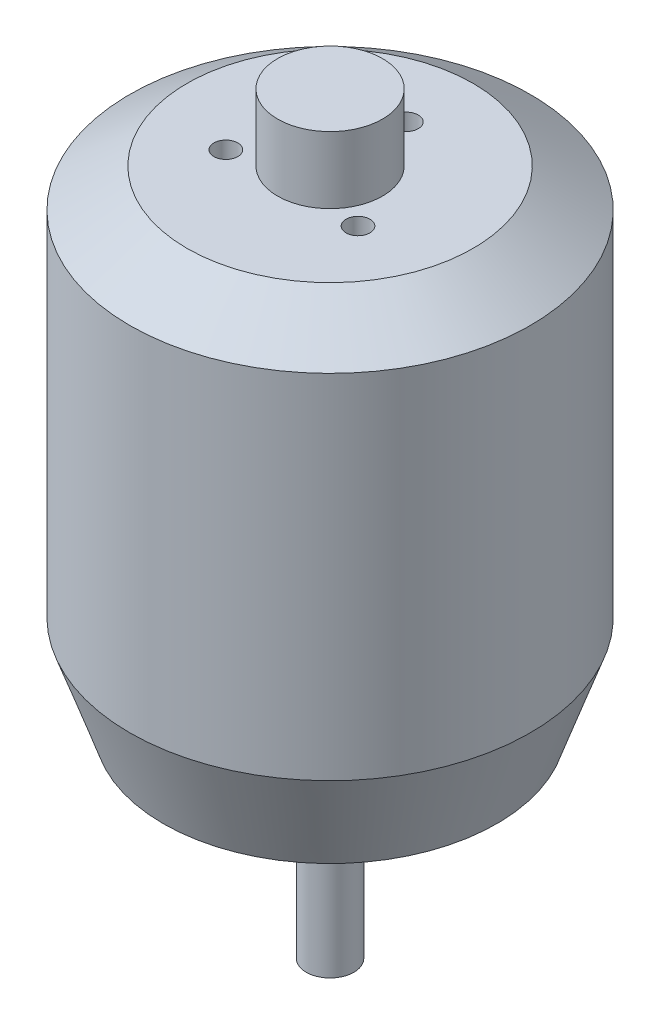
ISO-10303-21;
HEADER;
FILE_DESCRIPTION(('STEP AP214'),'2;1');
FILE_NAME('part.step','',(''),(''),'','','');
FILE_SCHEMA(('AUTOMOTIVE_DESIGN { 1 0 10303 214 1 1 1 1 }'));
ENDSEC;
DATA;
#1=APPLICATION_CONTEXT('core data for automotive mechanical design processes');
#2=APPLICATION_PROTOCOL_DEFINITION('international standard','automotive_design',2000,#1);
#3=PRODUCT_CONTEXT('',#1,'mechanical');
#4=PRODUCT('Part','Part','',(#3));
#5=PRODUCT_RELATED_PRODUCT_CATEGORY('part','',(#4));
#6=PRODUCT_DEFINITION_FORMATION('','',#4);
#7=PRODUCT_DEFINITION_CONTEXT('part definition',#1,'design');
#8=PRODUCT_DEFINITION('design','',#6,#7);
#9=PRODUCT_DEFINITION_SHAPE('','',#8);
#10=(LENGTH_UNIT() NAMED_UNIT(*) SI_UNIT(.MILLI.,.METRE.));
#11=(NAMED_UNIT(*) PLANE_ANGLE_UNIT() SI_UNIT($,.RADIAN.));
#12=(NAMED_UNIT(*) SI_UNIT($,.STERADIAN.) SOLID_ANGLE_UNIT());
#13=UNCERTAINTY_MEASURE_WITH_UNIT(LENGTH_MEASURE(1.E-05),#10,'distance_accuracy_value','');
#14=(GEOMETRIC_REPRESENTATION_CONTEXT(3) GLOBAL_UNCERTAINTY_ASSIGNED_CONTEXT((#13)) GLOBAL_UNIT_ASSIGNED_CONTEXT((#10,
#11,#12)) REPRESENTATION_CONTEXT('',''));
#15=CARTESIAN_POINT('',(0.,0.,0.));
#16=DIRECTION('',(0.,0.,1.));
#17=DIRECTION('',(1.,0.,0.));
#18=AXIS2_PLACEMENT_3D('',#15,#16,#17);
#19=CARTESIAN_POINT('',(0.,47.,0.));
#20=DIRECTION('',(0.,-1.,0.));
#21=DIRECTION('',(0.,0.,-1.));
#22=AXIS2_PLACEMENT_3D('',#19,#20,#21);
#23=CYLINDRICAL_SURFACE('',#22,21.);
#24=CARTESIAN_POINT('',(0.,47.,0.));
#25=DIRECTION('',(0.,1.,0.));
#26=DIRECTION('',(0.,0.,1.));
#27=AXIS2_PLACEMENT_3D('',#24,#25,#26);
#28=CIRCLE('',#27,21.);
#29=CARTESIAN_POINT('',(0.,47.,21.));
#30=VERTEX_POINT('',#29);
#31=EDGE_CURVE('E50',#30,#30,#28,.T.);
#32=ORIENTED_EDGE('',*,*,#31,.F.);
#33=EDGE_LOOP('',(#32));
#34=FACE_BOUND('',#33,.T.);
#35=CARTESIAN_POINT('',(0.,10.,0.));
#36=DIRECTION('',(0.,1.,0.));
#37=DIRECTION('',(0.,0.,1.));
#38=AXIS2_PLACEMENT_3D('',#35,#36,#37);
#39=CIRCLE('',#38,21.);
#40=CARTESIAN_POINT('',(0.,10.,21.));
#41=VERTEX_POINT('',#40);
#42=EDGE_CURVE('E64',#41,#41,#39,.T.);
#43=ORIENTED_EDGE('',*,*,#42,.T.);
#44=EDGE_LOOP('',(#43));
#45=FACE_BOUND('',#44,.T.);
#46=ADVANCED_FACE('F38',(#34,#45),#23,.T.);
#47=CARTESIAN_POINT('',(0.,0.,0.));
#48=DIRECTION('',(0.,1.,0.));
#49=DIRECTION('',(0.,0.,1.));
#50=AXIS2_PLACEMENT_3D('',#47,#48,#49);
#51=CONICAL_SURFACE('',#50,17.5,0.336674819386727);
#52=CARTESIAN_POINT('',(0.,0.,0.));
#53=DIRECTION('',(0.,1.,0.));
#54=DIRECTION('',(0.,0.,1.));
#55=AXIS2_PLACEMENT_3D('',#52,#53,#54);
#56=CIRCLE('',#55,17.5);
#57=CARTESIAN_POINT('',(0.,0.,17.5));
#58=VERTEX_POINT('',#57);
#59=EDGE_CURVE('E46',#58,#58,#56,.T.);
#60=ORIENTED_EDGE('',*,*,#59,.T.);
#61=EDGE_LOOP('',(#60));
#62=FACE_BOUND('',#61,.T.);
#63=ORIENTED_EDGE('',*,*,#42,.F.);
#64=EDGE_LOOP('',(#63));
#65=FACE_BOUND('',#64,.T.);
#66=ADVANCED_FACE('F172',(#62,#65),#51,.T.);
#67=CARTESIAN_POINT('',(0.,0.,0.));
#68=DIRECTION('',(0.,1.,0.));
#69=DIRECTION('',(0.,0.,1.));
#70=AXIS2_PLACEMENT_3D('',#67,#68,#69);
#71=PLANE('',#70);
#72=CARTESIAN_POINT('',(0.,0.,0.));
#73=DIRECTION('',(0.,1.,0.));
#74=DIRECTION('',(0.,0.,1.));
#75=AXIS2_PLACEMENT_3D('',#72,#73,#74);
#76=CIRCLE('',#75,5.25);
#77=CARTESIAN_POINT('',(0.,0.,5.25));
#78=VERTEX_POINT('',#77);
#79=EDGE_CURVE('E11',#78,#78,#76,.F.);
#80=ORIENTED_EDGE('',*,*,#79,.F.);
#81=EDGE_LOOP('',(#80));
#82=FACE_BOUND('',#81,.T.);
#83=CARTESIAN_POINT('',(-8.83883476483135,0.,-8.83883476483185));
#84=DIRECTION('',(0.,-1.,0.));
#85=DIRECTION('',(0.,0.,-1.));
#86=AXIS2_PLACEMENT_3D('',#83,#84,#85);
#87=CIRCLE('',#86,4.00000000000026);
#88=CARTESIAN_POINT('',(-8.83883476483135,0.,-12.8388347648321));
#89=VERTEX_POINT('',#88);
#90=EDGE_CURVE('E95',#89,#89,#87,.T.);
#91=ORIENTED_EDGE('',*,*,#90,.F.);
#92=EDGE_LOOP('',(#91));
#93=FACE_BOUND('',#92,.T.);
#94=CARTESIAN_POINT('',(8.83883476483235,0.,-8.83883476483135));
#95=DIRECTION('',(0.,-1.,0.));
#96=DIRECTION('',(0.,0.,-1.));
#97=AXIS2_PLACEMENT_3D('',#94,#95,#96);
#98=CIRCLE('',#97,4.0000000000007);
#99=CARTESIAN_POINT('',(8.83883476483235,0.,-12.838834764832));
#100=VERTEX_POINT('',#99);
#101=EDGE_CURVE('E101',#100,#100,#98,.T.);
#102=ORIENTED_EDGE('',*,*,#101,.F.);
#103=EDGE_LOOP('',(#102));
#104=FACE_BOUND('',#103,.T.);
#105=CARTESIAN_POINT('',(8.83883476483185,0.,8.83883476483234));
#106=DIRECTION('',(0.,-1.,0.));
#107=DIRECTION('',(0.,0.,-1.));
#108=AXIS2_PLACEMENT_3D('',#105,#106,#107);
#109=CIRCLE('',#108,4.00000000000051);
#110=CARTESIAN_POINT('',(8.83883476483185,0.,4.83883476483183));
#111=VERTEX_POINT('',#110);
#112=EDGE_CURVE('E107',#111,#111,#109,.T.);
#113=ORIENTED_EDGE('',*,*,#112,.F.);
#114=EDGE_LOOP('',(#113));
#115=FACE_BOUND('',#114,.T.);
#116=CARTESIAN_POINT('',(-8.83883476483184,0.,8.83883476483184));
#117=DIRECTION('',(0.,-1.,0.));
#118=DIRECTION('',(0.,0.,-1.));
#119=AXIS2_PLACEMENT_3D('',#116,#117,#118);
#120=CIRCLE('',#119,4.);
#121=CARTESIAN_POINT('',(-8.83883476483184,0.,4.83883476483184));
#122=VERTEX_POINT('',#121);
#123=EDGE_CURVE('E113',#122,#122,#120,.T.);
#124=ORIENTED_EDGE('',*,*,#123,.F.);
#125=EDGE_LOOP('',(#124));
#126=FACE_BOUND('',#125,.T.);
#127=CARTESIAN_POINT('',(-12.4999999999996,0.,-3.5527136788005E-13));
#128=DIRECTION('',(0.,-1.,0.));
#129=DIRECTION('',(0.,0.,-1.));
#130=AXIS2_PLACEMENT_3D('',#127,#128,#129);
#131=CIRCLE('',#130,1.50000000000057);
#132=CARTESIAN_POINT('',(-12.4999999999996,0.,-1.50000000000092));
#133=VERTEX_POINT('',#132);
#134=EDGE_CURVE('E77',#133,#133,#131,.T.);
#135=ORIENTED_EDGE('',*,*,#134,.F.);
#136=EDGE_LOOP('',(#135));
#137=FACE_BOUND('',#136,.T.);
#138=CARTESIAN_POINT('',(7.07481118762232E-13,0.,-12.5));
#139=DIRECTION('',(0.,-1.,0.));
#140=DIRECTION('',(0.,0.,-1.));
#141=AXIS2_PLACEMENT_3D('',#138,#139,#140);
#142=CIRCLE('',#141,1.50000000000076);
#143=CARTESIAN_POINT('',(7.07481118762232E-13,0.,-14.0000000000008));
#144=VERTEX_POINT('',#143);
#145=EDGE_CURVE('E84',#144,#144,#142,.T.);
#146=ORIENTED_EDGE('',*,*,#145,.F.);
#147=EDGE_LOOP('',(#146));
#148=FACE_BOUND('',#147,.T.);
#149=CARTESIAN_POINT('',(12.5000000000004,0.,3.53740559381116E-13));
#150=DIRECTION('',(0.,-1.,0.));
#151=DIRECTION('',(0.,0.,-1.));
#152=AXIS2_PLACEMENT_3D('',#149,#150,#151);
#153=CIRCLE('',#152,1.50000000000028);
#154=CARTESIAN_POINT('',(12.5000000000004,0.,-1.49999999999992));
#155=VERTEX_POINT('',#154);
#156=EDGE_CURVE('E90',#155,#155,#153,.T.);
#157=ORIENTED_EDGE('',*,*,#156,.F.);
#158=EDGE_LOOP('',(#157));
#159=FACE_BOUND('',#158,.T.);
#160=CARTESIAN_POINT('',(0.,0.,12.5));
#161=DIRECTION('',(0.,-1.,0.));
#162=DIRECTION('',(0.,0.,-1.));
#163=AXIS2_PLACEMENT_3D('',#160,#161,#162);
#164=CIRCLE('',#163,1.5);
#165=CARTESIAN_POINT('',(0.,0.,11.));
#166=VERTEX_POINT('',#165);
#167=EDGE_CURVE('E71',#166,#166,#164,.T.);
#168=ORIENTED_EDGE('',*,*,#167,.F.);
#169=EDGE_LOOP('',(#168));
#170=FACE_BOUND('',#169,.T.);
#171=ORIENTED_EDGE('',*,*,#59,.F.);
#172=EDGE_LOOP('',(#171));
#173=FACE_BOUND('',#172,.T.);
#174=ADVANCED_FACE('F40',(#82,#93,#104,#115,#126,#137,#148,#159,#170,#173),#71,.F.);
#175=CARTESIAN_POINT('',(0.,51.,0.));
#176=DIRECTION('',(0.,-1.,0.));
#177=DIRECTION('',(0.,0.,-1.));
#178=AXIS2_PLACEMENT_3D('',#175,#176,#177);
#179=CONICAL_SURFACE('',#178,15.,0.982793723247329);
#180=CARTESIAN_POINT('',(0.,51.,0.));
#181=DIRECTION('',(0.,1.,0.));
#182=DIRECTION('',(0.,0.,1.));
#183=AXIS2_PLACEMENT_3D('',#180,#181,#182);
#184=CIRCLE('',#183,15.);
#185=CARTESIAN_POINT('',(0.,51.,15.));
#186=VERTEX_POINT('',#185);
#187=EDGE_CURVE('E67',#186,#186,#184,.T.);
#188=ORIENTED_EDGE('',*,*,#187,.F.);
#189=EDGE_LOOP('',(#188));
#190=FACE_BOUND('',#189,.T.);
#191=ORIENTED_EDGE('',*,*,#31,.T.);
#192=EDGE_LOOP('',(#191));
#193=FACE_BOUND('',#192,.T.);
#194=ADVANCED_FACE('F163',(#190,#193),#179,.T.);
#195=CARTESIAN_POINT('',(0.,58.,0.));
#196=DIRECTION('',(0.,1.,0.));
#197=DIRECTION('',(0.,0.,1.));
#198=AXIS2_PLACEMENT_3D('',#195,#196,#197);
#199=PLANE('',#198);
#200=CARTESIAN_POINT('',(0.,58.,0.));
#201=DIRECTION('',(0.,1.,0.));
#202=DIRECTION('',(0.,0.,1.));
#203=AXIS2_PLACEMENT_3D('',#200,#201,#202);
#204=CIRCLE('',#203,5.5);
#205=CARTESIAN_POINT('',(0.,58.,5.5));
#206=VERTEX_POINT('',#205);
#207=EDGE_CURVE('E55',#206,#206,#204,.T.);
#208=ORIENTED_EDGE('',*,*,#207,.T.);
#209=EDGE_LOOP('',(#208));
#210=FACE_BOUND('',#209,.T.);
#211=ADVANCED_FACE('F166',(#210),#199,.T.);
#212=CARTESIAN_POINT('',(0.,58.,0.));
#213=DIRECTION('',(0.,-1.,0.));
#214=DIRECTION('',(0.,0.,-1.));
#215=AXIS2_PLACEMENT_3D('',#212,#213,#214);
#216=CYLINDRICAL_SURFACE('',#215,5.5);
#217=ORIENTED_EDGE('',*,*,#207,.F.);
#218=EDGE_LOOP('',(#217));
#219=FACE_BOUND('',#218,.T.);
#220=CARTESIAN_POINT('',(0.,51.,0.));
#221=DIRECTION('',(0.,1.,0.));
#222=DIRECTION('',(0.,0.,1.));
#223=AXIS2_PLACEMENT_3D('',#220,#221,#222);
#224=CIRCLE('',#223,5.5);
#225=CARTESIAN_POINT('',(0.,51.,5.5));
#226=VERTEX_POINT('',#225);
#227=EDGE_CURVE('E56',#226,#226,#224,.T.);
#228=ORIENTED_EDGE('',*,*,#227,.T.);
#229=EDGE_LOOP('',(#228));
#230=FACE_BOUND('',#229,.T.);
#231=ADVANCED_FACE('F153',(#219,#230),#216,.T.);
#232=CARTESIAN_POINT('',(0.,51.,0.));
#233=DIRECTION('',(0.,1.,0.));
#234=DIRECTION('',(0.,0.,1.));
#235=AXIS2_PLACEMENT_3D('',#232,#233,#234);
#236=PLANE('',#235);
#237=CARTESIAN_POINT('',(6.92820323027602,51.,3.9999999999997));
#238=DIRECTION('',(0.,1.,0.));
#239=DIRECTION('',(0.,0.,1.));
#240=AXIS2_PLACEMENT_3D('',#237,#238,#239);
#241=CIRCLE('',#240,1.25000000000044);
#242=CARTESIAN_POINT('',(6.92820323027602,51.,5.25000000000014));
#243=VERTEX_POINT('',#242);
#244=EDGE_CURVE('E134',#243,#243,#241,.T.);
#245=ORIENTED_EDGE('',*,*,#244,.F.);
#246=EDGE_LOOP('',(#245));
#247=FACE_BOUND('',#246,.T.);
#248=CARTESIAN_POINT('',(-6.928203230275,51.,4.0000000000003));
#249=DIRECTION('',(0.,1.,0.));
#250=DIRECTION('',(0.,0.,1.));
#251=AXIS2_PLACEMENT_3D('',#248,#249,#250);
#252=CIRCLE('',#251,1.25000000000065);
#253=CARTESIAN_POINT('',(-6.928203230275,51.,5.25000000000095));
#254=VERTEX_POINT('',#253);
#255=EDGE_CURVE('E128',#254,#254,#252,.T.);
#256=ORIENTED_EDGE('',*,*,#255,.F.);
#257=EDGE_LOOP('',(#256));
#258=FACE_BOUND('',#257,.T.);
#259=CARTESIAN_POINT('',(0.,51.,-8.));
#260=DIRECTION('',(0.,1.,0.));
#261=DIRECTION('',(0.,0.,1.));
#262=AXIS2_PLACEMENT_3D('',#259,#260,#261);
#263=CIRCLE('',#262,1.25);
#264=CARTESIAN_POINT('',(0.,51.,-6.75));
#265=VERTEX_POINT('',#264);
#266=EDGE_CURVE('E122',#265,#265,#263,.T.);
#267=ORIENTED_EDGE('',*,*,#266,.F.);
#268=EDGE_LOOP('',(#267));
#269=FACE_BOUND('',#268,.T.);
#270=ORIENTED_EDGE('',*,*,#227,.F.);
#271=EDGE_LOOP('',(#270));
#272=FACE_BOUND('',#271,.T.);
#273=ORIENTED_EDGE('',*,*,#187,.T.);
#274=EDGE_LOOP('',(#273));
#275=FACE_BOUND('',#274,.T.);
#276=ADVANCED_FACE('F149',(#247,#258,#269,#272,#275),#236,.T.);
#277=CARTESIAN_POINT('',(0.,10.,12.5));
#278=DIRECTION('',(0.,-1.,0.));
#279=DIRECTION('',(0.,0.,-1.));
#280=AXIS2_PLACEMENT_3D('',#277,#278,#279);
#281=CYLINDRICAL_SURFACE('',#280,1.5);
#282=CARTESIAN_POINT('',(0.,10.,12.5));
#283=DIRECTION('',(0.,-1.,0.));
#284=DIRECTION('',(0.,0.,-1.));
#285=AXIS2_PLACEMENT_3D('',#282,#283,#284);
#286=CIRCLE('',#285,1.5);
#287=CARTESIAN_POINT('',(0.,10.,11.));
#288=VERTEX_POINT('',#287);
#289=EDGE_CURVE('E70',#288,#288,#286,.T.);
#290=ORIENTED_EDGE('',*,*,#289,.F.);
#291=EDGE_LOOP('',(#290));
#292=FACE_BOUND('',#291,.T.);
#293=ORIENTED_EDGE('',*,*,#167,.T.);
#294=EDGE_LOOP('',(#293));
#295=FACE_BOUND('',#294,.T.);
#296=ADVANCED_FACE('F152',(#292,#295),#281,.F.);
#297=CARTESIAN_POINT('',(0.,10.,12.5));
#298=DIRECTION('',(0.,-1.,0.));
#299=DIRECTION('',(0.,0.,-1.));
#300=AXIS2_PLACEMENT_3D('',#297,#298,#299);
#301=PLANE('',#300);
#302=ORIENTED_EDGE('',*,*,#289,.T.);
#303=EDGE_LOOP('',(#302));
#304=FACE_BOUND('',#303,.T.);
#305=ADVANCED_FACE('F218',(#304),#301,.T.);
#306=CARTESIAN_POINT('',(12.5000000000004,10.,3.53740559381116E-13));
#307=DIRECTION('',(0.,-1.,0.));
#308=DIRECTION('',(0.,0.,-1.));
#309=AXIS2_PLACEMENT_3D('',#306,#307,#308);
#310=CYLINDRICAL_SURFACE('',#309,1.50000000000028);
#311=CARTESIAN_POINT('',(12.5000000000004,10.,3.53740559381116E-13));
#312=DIRECTION('',(0.,-1.,0.));
#313=DIRECTION('',(0.,0.,-1.));
#314=AXIS2_PLACEMENT_3D('',#311,#312,#313);
#315=CIRCLE('',#314,1.50000000000028);
#316=CARTESIAN_POINT('',(12.5000000000004,10.,-1.49999999999992));
#317=VERTEX_POINT('',#316);
#318=EDGE_CURVE('E74',#317,#317,#315,.T.);
#319=ORIENTED_EDGE('',*,*,#318,.F.);
#320=EDGE_LOOP('',(#319));
#321=FACE_BOUND('',#320,.T.);
#322=ORIENTED_EDGE('',*,*,#156,.T.);
#323=EDGE_LOOP('',(#322));
#324=FACE_BOUND('',#323,.T.);
#325=ADVANCED_FACE('F226',(#321,#324),#310,.F.);
#326=CARTESIAN_POINT('',(12.5000000000004,10.,3.53740559381116E-13));
#327=DIRECTION('',(0.,-1.,0.));
#328=DIRECTION('',(0.,0.,-1.));
#329=AXIS2_PLACEMENT_3D('',#326,#327,#328);
#330=PLANE('',#329);
#331=ORIENTED_EDGE('',*,*,#318,.T.);
#332=EDGE_LOOP('',(#331));
#333=FACE_BOUND('',#332,.T.);
#334=ADVANCED_FACE('F234',(#333),#330,.T.);
#335=CARTESIAN_POINT('',(7.07481118762232E-13,10.,-12.5));
#336=DIRECTION('',(0.,-1.,0.));
#337=DIRECTION('',(0.,0.,-1.));
#338=AXIS2_PLACEMENT_3D('',#335,#336,#337);
#339=CYLINDRICAL_SURFACE('',#338,1.50000000000076);
#340=CARTESIAN_POINT('',(7.07481118762232E-13,10.,-12.5));
#341=DIRECTION('',(0.,-1.,0.));
#342=DIRECTION('',(0.,0.,-1.));
#343=AXIS2_PLACEMENT_3D('',#340,#341,#342);
#344=CIRCLE('',#343,1.50000000000076);
#345=CARTESIAN_POINT('',(7.07481118762232E-13,10.,-14.0000000000008));
#346=VERTEX_POINT('',#345);
#347=EDGE_CURVE('E87',#346,#346,#344,.T.);
#348=ORIENTED_EDGE('',*,*,#347,.F.);
#349=EDGE_LOOP('',(#348));
#350=FACE_BOUND('',#349,.T.);
#351=ORIENTED_EDGE('',*,*,#145,.T.);
#352=EDGE_LOOP('',(#351));
#353=FACE_BOUND('',#352,.T.);
#354=ADVANCED_FACE('F242',(#350,#353),#339,.F.);
#355=CARTESIAN_POINT('',(7.07481118762232E-13,10.,-12.5));
#356=DIRECTION('',(0.,-1.,0.));
#357=DIRECTION('',(0.,0.,-1.));
#358=AXIS2_PLACEMENT_3D('',#355,#356,#357);
#359=PLANE('',#358);
#360=ORIENTED_EDGE('',*,*,#347,.T.);
#361=EDGE_LOOP('',(#360));
#362=FACE_BOUND('',#361,.T.);
#363=ADVANCED_FACE('F250',(#362),#359,.T.);
#364=CARTESIAN_POINT('',(-12.4999999999996,10.,-3.5527136788005E-13));
#365=DIRECTION('',(0.,-1.,0.));
#366=DIRECTION('',(0.,0.,-1.));
#367=AXIS2_PLACEMENT_3D('',#364,#365,#366);
#368=CYLINDRICAL_SURFACE('',#367,1.50000000000057);
#369=CARTESIAN_POINT('',(-12.4999999999996,10.,-3.5527136788005E-13));
#370=DIRECTION('',(0.,-1.,0.));
#371=DIRECTION('',(0.,0.,-1.));
#372=AXIS2_PLACEMENT_3D('',#369,#370,#371);
#373=CIRCLE('',#372,1.50000000000057);
#374=CARTESIAN_POINT('',(-12.4999999999996,10.,-1.50000000000092));
#375=VERTEX_POINT('',#374);
#376=EDGE_CURVE('E80',#375,#375,#373,.T.);
#377=ORIENTED_EDGE('',*,*,#376,.F.);
#378=EDGE_LOOP('',(#377));
#379=FACE_BOUND('',#378,.T.);
#380=ORIENTED_EDGE('',*,*,#134,.T.);
#381=EDGE_LOOP('',(#380));
#382=FACE_BOUND('',#381,.T.);
#383=ADVANCED_FACE('F258',(#379,#382),#368,.F.);
#384=CARTESIAN_POINT('',(-12.4999999999996,10.,-3.5527136788005E-13));
#385=DIRECTION('',(0.,-1.,0.));
#386=DIRECTION('',(0.,0.,-1.));
#387=AXIS2_PLACEMENT_3D('',#384,#385,#386);
#388=PLANE('',#387);
#389=ORIENTED_EDGE('',*,*,#376,.T.);
#390=EDGE_LOOP('',(#389));
#391=FACE_BOUND('',#390,.T.);
#392=ADVANCED_FACE('F266',(#391),#388,.T.);
#393=CARTESIAN_POINT('',(-8.83883476483184,10.,8.83883476483184));
#394=DIRECTION('',(0.,-1.,0.));
#395=DIRECTION('',(0.,0.,-1.));
#396=AXIS2_PLACEMENT_3D('',#393,#394,#395);
#397=CYLINDRICAL_SURFACE('',#396,4.);
#398=CARTESIAN_POINT('',(-8.83883476483184,10.,8.83883476483184));
#399=DIRECTION('',(0.,-1.,0.));
#400=DIRECTION('',(0.,0.,-1.));
#401=AXIS2_PLACEMENT_3D('',#398,#399,#400);
#402=CIRCLE('',#401,4.);
#403=CARTESIAN_POINT('',(-8.83883476483184,10.,4.83883476483184));
#404=VERTEX_POINT('',#403);
#405=EDGE_CURVE('E81',#404,#404,#402,.T.);
#406=ORIENTED_EDGE('',*,*,#405,.F.);
#407=EDGE_LOOP('',(#406));
#408=FACE_BOUND('',#407,.T.);
#409=ORIENTED_EDGE('',*,*,#123,.T.);
#410=EDGE_LOOP('',(#409));
#411=FACE_BOUND('',#410,.T.);
#412=ADVANCED_FACE('F274',(#408,#411),#397,.F.);
#413=CARTESIAN_POINT('',(-8.83883476483184,10.,8.83883476483184));
#414=DIRECTION('',(0.,-1.,0.));
#415=DIRECTION('',(0.,0.,-1.));
#416=AXIS2_PLACEMENT_3D('',#413,#414,#415);
#417=PLANE('',#416);
#418=ORIENTED_EDGE('',*,*,#405,.T.);
#419=EDGE_LOOP('',(#418));
#420=FACE_BOUND('',#419,.T.);
#421=ADVANCED_FACE('F282',(#420),#417,.T.);
#422=CARTESIAN_POINT('',(8.83883476483185,10.,8.83883476483234));
#423=DIRECTION('',(0.,-1.,0.));
#424=DIRECTION('',(0.,0.,-1.));
#425=AXIS2_PLACEMENT_3D('',#422,#423,#424);
#426=CYLINDRICAL_SURFACE('',#425,4.00000000000051);
#427=CARTESIAN_POINT('',(8.83883476483185,10.,8.83883476483234));
#428=DIRECTION('',(0.,-1.,0.));
#429=DIRECTION('',(0.,0.,-1.));
#430=AXIS2_PLACEMENT_3D('',#427,#428,#429);
#431=CIRCLE('',#430,4.00000000000051);
#432=CARTESIAN_POINT('',(8.83883476483185,10.,4.83883476483183));
#433=VERTEX_POINT('',#432);
#434=EDGE_CURVE('E110',#433,#433,#431,.T.);
#435=ORIENTED_EDGE('',*,*,#434,.F.);
#436=EDGE_LOOP('',(#435));
#437=FACE_BOUND('',#436,.T.);
#438=ORIENTED_EDGE('',*,*,#112,.T.);
#439=EDGE_LOOP('',(#438));
#440=FACE_BOUND('',#439,.T.);
#441=ADVANCED_FACE('F290',(#437,#440),#426,.F.);
#442=CARTESIAN_POINT('',(8.83883476483185,10.,8.83883476483234));
#443=DIRECTION('',(0.,-1.,0.));
#444=DIRECTION('',(0.,0.,-1.));
#445=AXIS2_PLACEMENT_3D('',#442,#443,#444);
#446=PLANE('',#445);
#447=ORIENTED_EDGE('',*,*,#434,.T.);
#448=EDGE_LOOP('',(#447));
#449=FACE_BOUND('',#448,.T.);
#450=ADVANCED_FACE('F298',(#449),#446,.T.);
#451=CARTESIAN_POINT('',(8.83883476483235,10.,-8.83883476483135));
#452=DIRECTION('',(0.,-1.,0.));
#453=DIRECTION('',(0.,0.,-1.));
#454=AXIS2_PLACEMENT_3D('',#451,#452,#453);
#455=CYLINDRICAL_SURFACE('',#454,4.0000000000007);
#456=CARTESIAN_POINT('',(8.83883476483235,10.,-8.83883476483135));
#457=DIRECTION('',(0.,-1.,0.));
#458=DIRECTION('',(0.,0.,-1.));
#459=AXIS2_PLACEMENT_3D('',#456,#457,#458);
#460=CIRCLE('',#459,4.0000000000007);
#461=CARTESIAN_POINT('',(8.83883476483235,10.,-12.838834764832));
#462=VERTEX_POINT('',#461);
#463=EDGE_CURVE('E104',#462,#462,#460,.T.);
#464=ORIENTED_EDGE('',*,*,#463,.F.);
#465=EDGE_LOOP('',(#464));
#466=FACE_BOUND('',#465,.T.);
#467=ORIENTED_EDGE('',*,*,#101,.T.);
#468=EDGE_LOOP('',(#467));
#469=FACE_BOUND('',#468,.T.);
#470=ADVANCED_FACE('F306',(#466,#469),#455,.F.);
#471=CARTESIAN_POINT('',(8.83883476483235,10.,-8.83883476483135));
#472=DIRECTION('',(0.,-1.,0.));
#473=DIRECTION('',(0.,0.,-1.));
#474=AXIS2_PLACEMENT_3D('',#471,#472,#473);
#475=PLANE('',#474);
#476=ORIENTED_EDGE('',*,*,#463,.T.);
#477=EDGE_LOOP('',(#476));
#478=FACE_BOUND('',#477,.T.);
#479=ADVANCED_FACE('F314',(#478),#475,.T.);
#480=CARTESIAN_POINT('',(-8.83883476483135,10.,-8.83883476483185));
#481=DIRECTION('',(0.,-1.,0.));
#482=DIRECTION('',(0.,0.,-1.));
#483=AXIS2_PLACEMENT_3D('',#480,#481,#482);
#484=CYLINDRICAL_SURFACE('',#483,4.00000000000026);
#485=CARTESIAN_POINT('',(-8.83883476483135,10.,-8.83883476483185));
#486=DIRECTION('',(0.,-1.,0.));
#487=DIRECTION('',(0.,0.,-1.));
#488=AXIS2_PLACEMENT_3D('',#485,#486,#487);
#489=CIRCLE('',#488,4.00000000000026);
#490=CARTESIAN_POINT('',(-8.83883476483135,10.,-12.8388347648321));
#491=VERTEX_POINT('',#490);
#492=EDGE_CURVE('E98',#491,#491,#489,.T.);
#493=ORIENTED_EDGE('',*,*,#492,.F.);
#494=EDGE_LOOP('',(#493));
#495=FACE_BOUND('',#494,.T.);
#496=ORIENTED_EDGE('',*,*,#90,.T.);
#497=EDGE_LOOP('',(#496));
#498=FACE_BOUND('',#497,.T.);
#499=ADVANCED_FACE('F322',(#495,#498),#484,.F.);
#500=CARTESIAN_POINT('',(-8.83883476483135,10.,-8.83883476483185));
#501=DIRECTION('',(0.,-1.,0.));
#502=DIRECTION('',(0.,0.,-1.));
#503=AXIS2_PLACEMENT_3D('',#500,#501,#502);
#504=PLANE('',#503);
#505=ORIENTED_EDGE('',*,*,#492,.T.);
#506=EDGE_LOOP('',(#505));
#507=FACE_BOUND('',#506,.T.);
#508=ADVANCED_FACE('F330',(#507),#504,.T.);
#509=CARTESIAN_POINT('',(0.,-6.5,0.));
#510=DIRECTION('',(0.,1.,0.));
#511=DIRECTION('',(0.,0.,1.));
#512=AXIS2_PLACEMENT_3D('',#509,#510,#511);
#513=CYLINDRICAL_SURFACE('',#512,5.25);
#514=CARTESIAN_POINT('',(0.,-6.5,0.));
#515=DIRECTION('',(0.,-1.,0.));
#516=DIRECTION('',(0.,0.,-1.));
#517=AXIS2_PLACEMENT_3D('',#514,#515,#516);
#518=CIRCLE('',#517,5.25);
#519=CARTESIAN_POINT('',(0.,-6.5,5.25));
#520=VERTEX_POINT('',#519);
#521=EDGE_CURVE('E118',#520,#520,#518,.T.);
#522=CARTESIAN_POINT('',(0.,-6.5,5.25));
#523=CARTESIAN_POINT('',(0.,-6.43229166666667,5.25));
#524=CARTESIAN_POINT('',(0.,-6.36458333333333,5.25));
#525=CARTESIAN_POINT('',(0.,-6.22916666666667,5.25));
#526=CARTESIAN_POINT('',(0.,-6.16145833333333,5.25));
#527=CARTESIAN_POINT('',(0.,-6.02604166666667,5.25));
#528=CARTESIAN_POINT('',(0.,-5.95833333333333,5.25));
#529=CARTESIAN_POINT('',(0.,-5.82291666666667,5.25));
#530=CARTESIAN_POINT('',(0.,-5.75520833333333,5.25));
#531=CARTESIAN_POINT('',(0.,-5.61979166666667,5.25));
#532=CARTESIAN_POINT('',(0.,-5.55208333333333,5.25));
#533=CARTESIAN_POINT('',(0.,-5.41666666666667,5.25));
#534=CARTESIAN_POINT('',(0.,-5.34895833333333,5.25));
#535=CARTESIAN_POINT('',(0.,-5.21354166666667,5.25));
#536=CARTESIAN_POINT('',(0.,-5.14583333333333,5.25));
#537=CARTESIAN_POINT('',(0.,-5.01041666666667,5.25));
#538=CARTESIAN_POINT('',(0.,-4.94270833333333,5.25));
#539=CARTESIAN_POINT('',(0.,-4.80729166666667,5.25));
#540=CARTESIAN_POINT('',(0.,-4.73958333333333,5.25));
#541=CARTESIAN_POINT('',(0.,-4.60416666666667,5.25));
#542=CARTESIAN_POINT('',(0.,-4.53645833333333,5.25));
#543=CARTESIAN_POINT('',(0.,-4.40104166666667,5.25));
#544=CARTESIAN_POINT('',(0.,-4.33333333333333,5.25));
#545=CARTESIAN_POINT('',(0.,-4.19791666666667,5.25));
#546=CARTESIAN_POINT('',(0.,-4.13020833333333,5.25));
#547=CARTESIAN_POINT('',(0.,-3.99479166666667,5.25));
#548=CARTESIAN_POINT('',(0.,-3.92708333333333,5.25));
#549=CARTESIAN_POINT('',(0.,-3.79166666666667,5.25));
#550=CARTESIAN_POINT('',(0.,-3.72395833333333,5.25));
#551=CARTESIAN_POINT('',(0.,-3.58854166666667,5.25));
#552=CARTESIAN_POINT('',(0.,-3.52083333333333,5.25));
#553=CARTESIAN_POINT('',(0.,-3.38541666666667,5.25));
#554=CARTESIAN_POINT('',(0.,-3.31770833333333,5.25));
#555=CARTESIAN_POINT('',(0.,-3.18229166666667,5.25));
#556=CARTESIAN_POINT('',(0.,-3.11458333333333,5.25));
#557=CARTESIAN_POINT('',(0.,-2.97916666666667,5.25));
#558=CARTESIAN_POINT('',(0.,-2.91145833333333,5.25));
#559=CARTESIAN_POINT('',(0.,-2.77604166666667,5.25));
#560=CARTESIAN_POINT('',(0.,-2.70833333333333,5.25));
#561=CARTESIAN_POINT('',(0.,-2.57291666666667,5.25));
#562=CARTESIAN_POINT('',(0.,-2.50520833333333,5.25));
#563=CARTESIAN_POINT('',(0.,-2.36979166666667,5.25));
#564=CARTESIAN_POINT('',(0.,-2.30208333333333,5.25));
#565=CARTESIAN_POINT('',(0.,-2.16666666666667,5.25));
#566=CARTESIAN_POINT('',(0.,-2.09895833333333,5.25));
#567=CARTESIAN_POINT('',(0.,-1.96354166666667,5.25));
#568=CARTESIAN_POINT('',(0.,-1.89583333333333,5.25));
#569=CARTESIAN_POINT('',(0.,-1.76041666666667,5.25));
#570=CARTESIAN_POINT('',(0.,-1.69270833333333,5.25));
#571=CARTESIAN_POINT('',(0.,-1.55729166666667,5.25));
#572=CARTESIAN_POINT('',(0.,-1.48958333333333,5.25));
#573=CARTESIAN_POINT('',(0.,-1.35416666666667,5.25));
#574=CARTESIAN_POINT('',(0.,-1.28645833333333,5.25));
#575=CARTESIAN_POINT('',(0.,-1.15104166666667,5.25));
#576=CARTESIAN_POINT('',(0.,-1.08333333333333,5.25));
#577=CARTESIAN_POINT('',(0.,-0.947916666666667,5.25));
#578=CARTESIAN_POINT('',(0.,-0.880208333333333,5.25));
#579=CARTESIAN_POINT('',(0.,-0.744791666666667,5.25));
#580=CARTESIAN_POINT('',(0.,-0.677083333333333,5.25));
#581=CARTESIAN_POINT('',(0.,-0.541666666666667,5.25));
#582=CARTESIAN_POINT('',(0.,-0.473958333333333,5.25));
#583=CARTESIAN_POINT('',(0.,-0.338541666666667,5.25));
#584=CARTESIAN_POINT('',(0.,-0.270833333333334,5.25));
#585=CARTESIAN_POINT('',(0.,-0.135416666666667,5.25));
#586=CARTESIAN_POINT('',(0.,-0.0677083333333334,5.25));
#587=CARTESIAN_POINT('',(0.,0.,5.25));
#588=B_SPLINE_CURVE_WITH_KNOTS('',3,(#522,#523,#524,#525,#526,#527,#528,#529,#530,#531,#532,
#533,#534,#535,#536,#537,#538,#539,#540,#541,#542,#543,#544,#545,#546,#547,#548,#549,#550,#551,
#552,#553,#554,#555,#556,#557,#558,#559,#560,#561,#562,#563,#564,#565,#566,#567,#568,#569,#570,
#571,#572,#573,#574,#575,#576,#577,#578,#579,#580,#581,#582,#583,#584,#585,#586,#587),
.UNSPECIFIED.,.F.,.F.,(4,2,2,2,2,2,2,2,2,2,2,2,2,2,2,2,2,2,2,2,2,2,2,2,2,2,2,2,2,2,2,2,4),(0.,
0.203124999999999,0.40625,0.609375,0.812499999999999,1.015625,1.21875,1.421875,1.625,1.828125,
2.03125,2.234375,2.4375,2.640625,2.84375,3.046875,3.25,3.453125,3.65625,3.859375,4.0625,
4.265625,4.46875,4.671875,4.875,5.078125,5.28125,5.484375,5.6875,5.890625,6.09375,6.296875,6.5),.UNSPECIFIED.);
#589=EDGE_CURVE('BSEAM338',#520,#78,#588,.T.);
#590=ORIENTED_EDGE('',*,*,#521,.F.);
#591=ORIENTED_EDGE('',*,*,#79,.T.);
#592=ORIENTED_EDGE('',*,*,#589,.T.);
#593=ORIENTED_EDGE('',*,*,#589,.F.);
#594=EDGE_LOOP('',(#590,#592,#591,#593));
#595=FACE_BOUND('',#594,.T.);
#596=ADVANCED_FACE('F338',(#595),#513,.T.);
#597=CARTESIAN_POINT('',(0.,-6.5,0.));
#598=DIRECTION('',(0.,-1.,0.));
#599=DIRECTION('',(0.,0.,-1.));
#600=AXIS2_PLACEMENT_3D('',#597,#598,#599);
#601=PLANE('',#600);
#602=CARTESIAN_POINT('',(0.,-6.5,0.));
#603=DIRECTION('',(0.,-1.,0.));
#604=DIRECTION('',(0.,0.,-1.));
#605=AXIS2_PLACEMENT_3D('',#602,#603,#604);
#606=CIRCLE('',#605,2.5);
#607=CARTESIAN_POINT('',(0.,-6.5,2.5));
#608=VERTEX_POINT('',#607);
#609=EDGE_CURVE('E42',#608,#608,#606,.T.);
#610=ORIENTED_EDGE('',*,*,#609,.F.);
#611=EDGE_LOOP('',(#610));
#612=FACE_BOUND('',#611,.T.);
#613=ORIENTED_EDGE('',*,*,#521,.T.);
#614=EDGE_LOOP('',(#613));
#615=FACE_BOUND('',#614,.T.);
#616=ADVANCED_FACE('F188',(#612,#615),#601,.T.);
#617=CARTESIAN_POINT('',(0.,-21.,0.));
#618=DIRECTION('',(0.,-1.,0.));
#619=DIRECTION('',(0.,0.,-1.));
#620=AXIS2_PLACEMENT_3D('',#617,#618,#619);
#621=PLANE('',#620);
#622=CARTESIAN_POINT('',(0.,-21.,0.));
#623=DIRECTION('',(0.,-1.,0.));
#624=DIRECTION('',(0.,0.,-1.));
#625=AXIS2_PLACEMENT_3D('',#622,#623,#624);
#626=CIRCLE('',#625,2.5);
#627=CARTESIAN_POINT('',(0.,-21.,2.5));
#628=VERTEX_POINT('',#627);
#629=EDGE_CURVE('E59',#628,#628,#626,.T.);
#630=ORIENTED_EDGE('',*,*,#629,.T.);
#631=EDGE_LOOP('',(#630));
#632=FACE_BOUND('',#631,.T.);
#633=ADVANCED_FACE('F184',(#632),#621,.T.);
#634=CARTESIAN_POINT('',(0.,-21.,0.));
#635=DIRECTION('',(0.,1.,0.));
#636=DIRECTION('',(0.,0.,1.));
#637=AXIS2_PLACEMENT_3D('',#634,#635,#636);
#638=CYLINDRICAL_SURFACE('',#637,2.5);
#639=CARTESIAN_POINT('',(0.,-6.5,2.5));
#640=CARTESIAN_POINT('',(0.,-6.65104166666666,2.5));
#641=CARTESIAN_POINT('',(0.,-6.80208333333333,2.5));
#642=CARTESIAN_POINT('',(0.,-7.10416666666666,2.5));
#643=CARTESIAN_POINT('',(0.,-7.25520833333333,2.5));
#644=CARTESIAN_POINT('',(0.,-7.55729166666666,2.5));
#645=CARTESIAN_POINT('',(0.,-7.70833333333333,2.5));
#646=CARTESIAN_POINT('',(0.,-8.01041666666666,2.5));
#647=CARTESIAN_POINT('',(0.,-8.16145833333333,2.5));
#648=CARTESIAN_POINT('',(0.,-8.46354166666666,2.5));
#649=CARTESIAN_POINT('',(0.,-8.61458333333333,2.5));
#650=CARTESIAN_POINT('',(0.,-8.91666666666666,2.5));
#651=CARTESIAN_POINT('',(0.,-9.06770833333333,2.5));
#652=CARTESIAN_POINT('',(0.,-9.36979166666666,2.5));
#653=CARTESIAN_POINT('',(0.,-9.52083333333333,2.5));
#654=CARTESIAN_POINT('',(0.,-9.82291666666667,2.5));
#655=CARTESIAN_POINT('',(0.,-9.97395833333333,2.5));
#656=CARTESIAN_POINT('',(0.,-10.2760416666667,2.5));
#657=CARTESIAN_POINT('',(0.,-10.4270833333333,2.5));
#658=CARTESIAN_POINT('',(0.,-10.7291666666667,2.5));
#659=CARTESIAN_POINT('',(0.,-10.8802083333333,2.5));
#660=CARTESIAN_POINT('',(0.,-11.1822916666667,2.5));
#661=CARTESIAN_POINT('',(0.,-11.3333333333333,2.5));
#662=CARTESIAN_POINT('',(0.,-11.6354166666667,2.5));
#663=CARTESIAN_POINT('',(0.,-11.7864583333333,2.5));
#664=CARTESIAN_POINT('',(0.,-12.0885416666667,2.5));
#665=CARTESIAN_POINT('',(0.,-12.2395833333333,2.5));
#666=CARTESIAN_POINT('',(0.,-12.5416666666667,2.5));
#667=CARTESIAN_POINT('',(0.,-12.6927083333333,2.5));
#668=CARTESIAN_POINT('',(0.,-12.9947916666667,2.5));
#669=CARTESIAN_POINT('',(0.,-13.1458333333333,2.5));
#670=CARTESIAN_POINT('',(0.,-13.4479166666667,2.5));
#671=CARTESIAN_POINT('',(0.,-13.5989583333333,2.5));
#672=CARTESIAN_POINT('',(0.,-13.9010416666667,2.5));
#673=CARTESIAN_POINT('',(0.,-14.0520833333333,2.5));
#674=CARTESIAN_POINT('',(0.,-14.3541666666667,2.5));
#675=CARTESIAN_POINT('',(0.,-14.5052083333333,2.5));
#676=CARTESIAN_POINT('',(0.,-14.8072916666667,2.5));
#677=CARTESIAN_POINT('',(0.,-14.9583333333333,2.5));
#678=CARTESIAN_POINT('',(0.,-15.2604166666667,2.5));
#679=CARTESIAN_POINT('',(0.,-15.4114583333333,2.5));
#680=CARTESIAN_POINT('',(0.,-15.7135416666667,2.5));
#681=CARTESIAN_POINT('',(0.,-15.8645833333333,2.5));
#682=CARTESIAN_POINT('',(0.,-16.1666666666667,2.5));
#683=CARTESIAN_POINT('',(0.,-16.3177083333333,2.5));
#684=CARTESIAN_POINT('',(0.,-16.6197916666667,2.5));
#685=CARTESIAN_POINT('',(0.,-16.7708333333333,2.5));
#686=CARTESIAN_POINT('',(0.,-17.0729166666667,2.5));
#687=CARTESIAN_POINT('',(0.,-17.2239583333333,2.5));
#688=CARTESIAN_POINT('',(0.,-17.5260416666667,2.5));
#689=CARTESIAN_POINT('',(0.,-17.6770833333333,2.5));
#690=CARTESIAN_POINT('',(0.,-17.9791666666667,2.5));
#691=CARTESIAN_POINT('',(0.,-18.1302083333333,2.5));
#692=CARTESIAN_POINT('',(0.,-18.4322916666667,2.5));
#693=CARTESIAN_POINT('',(0.,-18.5833333333333,2.5));
#694=CARTESIAN_POINT('',(0.,-18.8854166666667,2.5));
#695=CARTESIAN_POINT('',(0.,-19.0364583333333,2.5));
#696=CARTESIAN_POINT('',(0.,-19.3385416666667,2.5));
#697=CARTESIAN_POINT('',(0.,-19.4895833333333,2.5));
#698=CARTESIAN_POINT('',(0.,-19.7916666666667,2.5));
#699=CARTESIAN_POINT('',(0.,-19.9427083333333,2.5));
#700=CARTESIAN_POINT('',(0.,-20.2447916666667,2.5));
#701=CARTESIAN_POINT('',(0.,-20.3958333333333,2.5));
#702=CARTESIAN_POINT('',(0.,-20.6979166666667,2.5));
#703=CARTESIAN_POINT('',(0.,-20.8489583333333,2.5));
#704=CARTESIAN_POINT('',(0.,-21.,2.5));
#705=B_SPLINE_CURVE_WITH_KNOTS('',3,(#639,#640,#641,#642,#643,#644,#645,#646,#647,#648,#649,
#650,#651,#652,#653,#654,#655,#656,#657,#658,#659,#660,#661,#662,#663,#664,#665,#666,#667,#668,
#669,#670,#671,#672,#673,#674,#675,#676,#677,#678,#679,#680,#681,#682,#683,#684,#685,#686,#687,
#688,#689,#690,#691,#692,#693,#694,#695,#696,#697,#698,#699,#700,#701,#702,#703,#704),
.UNSPECIFIED.,.F.,.F.,(4,2,2,2,2,2,2,2,2,2,2,2,2,2,2,2,2,2,2,2,2,2,2,2,2,2,2,2,2,2,2,2,4),(0.,
0.453125,0.906250000000001,1.359375,1.8125,2.265625,2.71875,3.171875,3.625,4.078125,4.53125,
4.984375,5.4375,5.890625,6.34375,6.796875,7.25,7.703125,8.15625,8.609375,9.0625,9.515625,
9.96875,10.421875,10.875,11.328125,11.78125,12.234375,12.6875,13.140625,13.59375,14.046875,
14.5),.UNSPECIFIED.);
#706=EDGE_CURVE('BSEAM187',#608,#628,#705,.T.);
#707=ORIENTED_EDGE('',*,*,#609,.T.);
#708=ORIENTED_EDGE('',*,*,#629,.F.);
#709=ORIENTED_EDGE('',*,*,#706,.T.);
#710=ORIENTED_EDGE('',*,*,#706,.F.);
#711=EDGE_LOOP('',(#707,#709,#708,#710));
#712=FACE_BOUND('',#711,.T.);
#713=ADVANCED_FACE('F187',(#712),#638,.T.);
#714=CARTESIAN_POINT('',(0.,41.,-8.));
#715=DIRECTION('',(0.,1.,0.));
#716=DIRECTION('',(0.,0.,1.));
#717=AXIS2_PLACEMENT_3D('',#714,#715,#716);
#718=CYLINDRICAL_SURFACE('',#717,1.25);
#719=CARTESIAN_POINT('',(0.,41.,-8.));
#720=DIRECTION('',(0.,1.,0.));
#721=DIRECTION('',(0.,0.,1.));
#722=AXIS2_PLACEMENT_3D('',#719,#720,#721);
#723=CIRCLE('',#722,1.25);
#724=CARTESIAN_POINT('',(0.,41.,-6.75));
#725=VERTEX_POINT('',#724);
#726=EDGE_CURVE('E121',#725,#725,#723,.T.);
#727=ORIENTED_EDGE('',*,*,#726,.F.);
#728=EDGE_LOOP('',(#727));
#729=FACE_BOUND('',#728,.T.);
#730=ORIENTED_EDGE('',*,*,#266,.T.);
#731=EDGE_LOOP('',(#730));
#732=FACE_BOUND('',#731,.T.);
#733=ADVANCED_FACE('F192',(#729,#732),#718,.F.);
#734=CARTESIAN_POINT('',(0.,41.,-8.));
#735=DIRECTION('',(0.,1.,0.));
#736=DIRECTION('',(0.,0.,1.));
#737=AXIS2_PLACEMENT_3D('',#734,#735,#736);
#738=PLANE('',#737);
#739=ORIENTED_EDGE('',*,*,#726,.T.);
#740=EDGE_LOOP('',(#739));
#741=FACE_BOUND('',#740,.T.);
#742=ADVANCED_FACE('F367',(#741),#738,.T.);
#743=CARTESIAN_POINT('',(-6.928203230275,41.,4.0000000000003));
#744=DIRECTION('',(0.,1.,0.));
#745=DIRECTION('',(0.,0.,1.));
#746=AXIS2_PLACEMENT_3D('',#743,#744,#745);
#747=CYLINDRICAL_SURFACE('',#746,1.25000000000065);
#748=CARTESIAN_POINT('',(-6.928203230275,41.,4.0000000000003));
#749=DIRECTION('',(0.,1.,0.));
#750=DIRECTION('',(0.,0.,1.));
#751=AXIS2_PLACEMENT_3D('',#748,#749,#750);
#752=CIRCLE('',#751,1.25000000000065);
#753=CARTESIAN_POINT('',(-6.928203230275,41.,5.25000000000095));
#754=VERTEX_POINT('',#753);
#755=EDGE_CURVE('E131',#754,#754,#752,.T.);
#756=ORIENTED_EDGE('',*,*,#755,.F.);
#757=EDGE_LOOP('',(#756));
#758=FACE_BOUND('',#757,.T.);
#759=ORIENTED_EDGE('',*,*,#255,.T.);
#760=EDGE_LOOP('',(#759));
#761=FACE_BOUND('',#760,.T.);
#762=ADVANCED_FACE('F375',(#758,#761),#747,.F.);
#763=CARTESIAN_POINT('',(-6.928203230275,41.,4.0000000000003));
#764=DIRECTION('',(0.,1.,0.));
#765=DIRECTION('',(0.,0.,1.));
#766=AXIS2_PLACEMENT_3D('',#763,#764,#765);
#767=PLANE('',#766);
#768=ORIENTED_EDGE('',*,*,#755,.T.);
#769=EDGE_LOOP('',(#768));
#770=FACE_BOUND('',#769,.T.);
#771=ADVANCED_FACE('F145',(#770),#767,.T.);
#772=CARTESIAN_POINT('',(6.92820323027602,41.,3.9999999999997));
#773=DIRECTION('',(0.,1.,0.));
#774=DIRECTION('',(0.,0.,1.));
#775=AXIS2_PLACEMENT_3D('',#772,#773,#774);
#776=CYLINDRICAL_SURFACE('',#775,1.25000000000044);
#777=CARTESIAN_POINT('',(6.92820323027602,41.,3.9999999999997));
#778=DIRECTION('',(0.,1.,0.));
#779=DIRECTION('',(0.,0.,1.));
#780=AXIS2_PLACEMENT_3D('',#777,#778,#779);
#781=CIRCLE('',#780,1.25000000000044);
#782=CARTESIAN_POINT('',(6.92820323027602,41.,5.25000000000014));
#783=VERTEX_POINT('',#782);
#784=EDGE_CURVE('E125',#783,#783,#781,.T.);
#785=ORIENTED_EDGE('',*,*,#784,.F.);
#786=EDGE_LOOP('',(#785));
#787=FACE_BOUND('',#786,.T.);
#788=ORIENTED_EDGE('',*,*,#244,.T.);
#789=EDGE_LOOP('',(#788));
#790=FACE_BOUND('',#789,.T.);
#791=ADVANCED_FACE('F142',(#787,#790),#776,.F.);
#792=CARTESIAN_POINT('',(6.92820323027602,41.,3.9999999999997));
#793=DIRECTION('',(0.,1.,0.));
#794=DIRECTION('',(0.,0.,1.));
#795=AXIS2_PLACEMENT_3D('',#792,#793,#794);
#796=PLANE('',#795);
#797=ORIENTED_EDGE('',*,*,#784,.T.);
#798=EDGE_LOOP('',(#797));
#799=FACE_BOUND('',#798,.T.);
#800=ADVANCED_FACE('F140',(#799),#796,.T.);
#801=CLOSED_SHELL('',(#46,#66,#174,#194,#211,#231,#276,#296,#305,#325,#334,#354,#363,#383,#392,
#412,#421,#441,#450,#470,#479,#499,#508,#596,#616,#633,#713,#733,#742,#762,#771,#791,#800));
#802=MANIFOLD_SOLID_BREP('B2',#801);
#803=ADVANCED_BREP_SHAPE_REPRESENTATION('',(#18,#802),#14);
#804=SHAPE_DEFINITION_REPRESENTATION(#9,#803);
ENDSEC;
END-ISO-10303-21;
